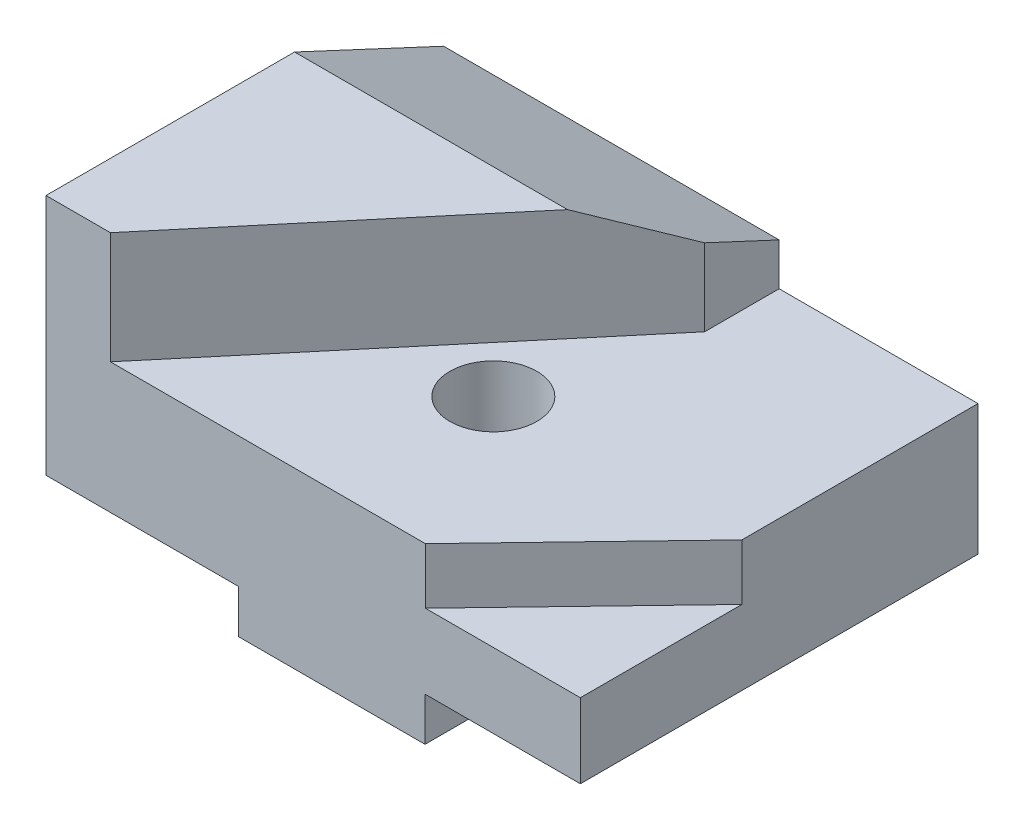
ISO-10303-21;
HEADER;
FILE_DESCRIPTION(('STEP AP214'),'2;1');
FILE_NAME('part.step','',(''),(''),'','','');
FILE_SCHEMA(('AUTOMOTIVE_DESIGN { 1 0 10303 214 1 1 1 1 }'));
ENDSEC;
DATA;
#1=APPLICATION_CONTEXT('core data for automotive mechanical design processes');
#2=APPLICATION_PROTOCOL_DEFINITION('international standard','automotive_design',2000,#1);
#3=PRODUCT_CONTEXT('',#1,'mechanical');
#4=PRODUCT('Part','Part','',(#3));
#5=PRODUCT_RELATED_PRODUCT_CATEGORY('part','',(#4));
#6=PRODUCT_DEFINITION_FORMATION('','',#4);
#7=PRODUCT_DEFINITION_CONTEXT('part definition',#1,'design');
#8=PRODUCT_DEFINITION('design','',#6,#7);
#9=PRODUCT_DEFINITION_SHAPE('','',#8);
#10=(LENGTH_UNIT() NAMED_UNIT(*) SI_UNIT(.MILLI.,.METRE.));
#11=(NAMED_UNIT(*) PLANE_ANGLE_UNIT() SI_UNIT($,.RADIAN.));
#12=(NAMED_UNIT(*) SI_UNIT($,.STERADIAN.) SOLID_ANGLE_UNIT());
#13=UNCERTAINTY_MEASURE_WITH_UNIT(LENGTH_MEASURE(1.E-05),#10,'distance_accuracy_value','');
#14=(GEOMETRIC_REPRESENTATION_CONTEXT(3) GLOBAL_UNCERTAINTY_ASSIGNED_CONTEXT((#13)) GLOBAL_UNIT_ASSIGNED_CONTEXT((#10,
#11,#12)) REPRESENTATION_CONTEXT('',''));
#15=CARTESIAN_POINT('',(0.,0.,0.));
#16=DIRECTION('',(0.,0.,1.));
#17=DIRECTION('',(1.,0.,0.));
#18=AXIS2_PLACEMENT_3D('',#15,#16,#17);
#19=CARTESIAN_POINT('',(86.,21.,-64.));
#20=DIRECTION('',(1.,0.,0.));
#21=DIRECTION('',(0.,0.,-1.));
#22=AXIS2_PLACEMENT_3D('',#19,#20,#21);
#23=PLANE('',#22);
#24=DIRECTION('',(0.,1.,0.));
#25=VECTOR('',#24,1.);
#26=CARTESIAN_POINT('',(86.,12.,-26.));
#27=LINE('',#26,#25);
#28=CARTESIAN_POINT('',(86.,12.,-26.));
#29=VERTEX_POINT('',#28);
#30=CARTESIAN_POINT('',(86.,21.,-26.));
#31=VERTEX_POINT('',#30);
#32=EDGE_CURVE('E149',#29,#31,#27,.T.);
#33=ORIENTED_EDGE('',*,*,#32,.F.);
#34=DIRECTION('',(0.,0.,1.));
#35=VECTOR('',#34,1.);
#36=CARTESIAN_POINT('',(86.,12.,0.));
#37=LINE('',#36,#35);
#38=CARTESIAN_POINT('',(86.,12.,0.));
#39=VERTEX_POINT('',#38);
#40=EDGE_CURVE('E140',#29,#39,#37,.T.);
#41=ORIENTED_EDGE('',*,*,#40,.T.);
#42=DIRECTION('',(0.,1.,0.));
#43=VECTOR('',#42,1.);
#44=CARTESIAN_POINT('',(86.,21.,0.));
#45=LINE('',#44,#43);
#46=CARTESIAN_POINT('',(86.,0.,0.));
#47=VERTEX_POINT('',#46);
#48=EDGE_CURVE('E227',#47,#39,#45,.T.);
#49=ORIENTED_EDGE('',*,*,#48,.F.);
#50=DIRECTION('',(0.,0.,1.));
#51=VECTOR('',#50,1.);
#52=CARTESIAN_POINT('',(86.,0.,-64.));
#53=LINE('',#52,#51);
#54=CARTESIAN_POINT('',(86.,0.,-64.));
#55=VERTEX_POINT('',#54);
#56=EDGE_CURVE('E244',#55,#47,#53,.T.);
#57=ORIENTED_EDGE('',*,*,#56,.F.);
#58=DIRECTION('',(0.,1.,0.));
#59=VECTOR('',#58,1.);
#60=CARTESIAN_POINT('',(86.,21.,-64.));
#61=LINE('',#60,#59);
#62=CARTESIAN_POINT('',(86.,21.,-64.));
#63=VERTEX_POINT('',#62);
#64=EDGE_CURVE('E203',#55,#63,#61,.T.);
#65=ORIENTED_EDGE('',*,*,#64,.T.);
#66=DIRECTION('',(0.,0.,1.));
#67=VECTOR('',#66,1.);
#68=CARTESIAN_POINT('',(86.,21.,-64.));
#69=LINE('',#68,#67);
#70=EDGE_CURVE('E152',#63,#31,#69,.T.);
#71=ORIENTED_EDGE('',*,*,#70,.T.);
#72=EDGE_LOOP('',(#33,#41,#49,#57,#65,#71));
#73=FACE_BOUND('',#72,.T.);
#74=ADVANCED_FACE('F39',(#73),#23,.T.);
#75=CARTESIAN_POINT('',(54.,39.,-64.));
#76=DIRECTION('',(1.,0.,0.));
#77=DIRECTION('',(0.,0.,-1.));
#78=AXIS2_PLACEMENT_3D('',#75,#76,#77);
#79=PLANE('',#78);
#80=DIRECTION('',(0.,1.,0.));
#81=VECTOR('',#80,1.);
#82=CARTESIAN_POINT('',(54.,21.,-52.));
#83=LINE('',#82,#81);
#84=CARTESIAN_POINT('',(54.,21.,-52.));
#85=VERTEX_POINT('',#84);
#86=CARTESIAN_POINT('',(54.,33.4043081021401,-52.));
#87=VERTEX_POINT('',#86);
#88=EDGE_CURVE('E65',#85,#87,#83,.T.);
#89=ORIENTED_EDGE('',*,*,#88,.F.);
#90=DIRECTION('',(0.,0.,1.));
#91=VECTOR('',#90,1.);
#92=CARTESIAN_POINT('',(54.,21.,-64.));
#93=LINE('',#92,#91);
#94=CARTESIAN_POINT('',(54.,21.,-64.));
#95=VERTEX_POINT('',#94);
#96=EDGE_CURVE('E238',#95,#85,#93,.T.);
#97=ORIENTED_EDGE('',*,*,#96,.F.);
#98=DIRECTION('',(0.,1.,0.));
#99=VECTOR('',#98,1.);
#100=CARTESIAN_POINT('',(54.,39.,-64.));
#101=LINE('',#100,#99);
#102=CARTESIAN_POINT('',(54.,27.8086162042802,-64.));
#103=VERTEX_POINT('',#102);
#104=EDGE_CURVE('E206',#95,#103,#101,.T.);
#105=ORIENTED_EDGE('',*,*,#104,.T.);
#106=DIRECTION('',(0.,0.422618261740694,0.906307787036653));
#107=VECTOR('',#106,1.);
#108=CARTESIAN_POINT('',(54.,47.3552472512671,-22.0821144470889));
#109=LINE('',#108,#107);
#110=EDGE_CURVE('E175',#103,#87,#109,.T.);
#111=ORIENTED_EDGE('',*,*,#110,.T.);
#112=EDGE_LOOP('',(#89,#97,#105,#111));
#113=FACE_BOUND('',#112,.T.);
#114=ADVANCED_FACE('F287',(#113),#79,.T.);
#115=CARTESIAN_POINT('',(0.,0.,-64.));
#116=DIRECTION('',(0.,0.,-1.));
#117=DIRECTION('',(-1.,0.,0.));
#118=AXIS2_PLACEMENT_3D('',#115,#116,#117);
#119=PLANE('',#118);
#120=DIRECTION('',(0.,-1.,0.));
#121=VECTOR('',#120,1.);
#122=CARTESIAN_POINT('',(0.,0.,-64.));
#123=LINE('',#122,#121);
#124=CARTESIAN_POINT('',(0.,27.8086162042802,-64.));
#125=VERTEX_POINT('',#124);
#126=CARTESIAN_POINT('',(0.,0.,-64.));
#127=VERTEX_POINT('',#126);
#128=EDGE_CURVE('E207',#125,#127,#123,.T.);
#129=ORIENTED_EDGE('',*,*,#128,.F.);
#130=DIRECTION('',(1.,0.,0.));
#131=VECTOR('',#130,1.);
#132=CARTESIAN_POINT('',(0.,27.8086162042802,-64.));
#133=LINE('',#132,#131);
#134=EDGE_CURVE('E177',#125,#103,#133,.T.);
#135=ORIENTED_EDGE('',*,*,#134,.T.);
#136=ORIENTED_EDGE('',*,*,#104,.F.);
#137=DIRECTION('',(-1.,0.,0.));
#138=VECTOR('',#137,1.);
#139=CARTESIAN_POINT('',(54.,21.,-64.));
#140=LINE('',#139,#138);
#141=EDGE_CURVE('E201',#63,#95,#140,.T.);
#142=ORIENTED_EDGE('',*,*,#141,.F.);
#143=ORIENTED_EDGE('',*,*,#64,.F.);
#144=DIRECTION('',(1.,0.,0.));
#145=VECTOR('',#144,1.);
#146=CARTESIAN_POINT('',(86.,0.,-64.));
#147=LINE('',#146,#145);
#148=CARTESIAN_POINT('',(61.,0.,-64.));
#149=VERTEX_POINT('',#148);
#150=EDGE_CURVE('E196',#149,#55,#147,.T.);
#151=ORIENTED_EDGE('',*,*,#150,.F.);
#152=DIRECTION('',(0.,1.,0.));
#153=VECTOR('',#152,1.);
#154=CARTESIAN_POINT('',(61.,0.,-64.));
#155=LINE('',#154,#153);
#156=CARTESIAN_POINT('',(61.,-7.,-64.));
#157=VERTEX_POINT('',#156);
#158=EDGE_CURVE('E193',#157,#149,#155,.T.);
#159=ORIENTED_EDGE('',*,*,#158,.F.);
#160=DIRECTION('',(1.,0.,0.));
#161=VECTOR('',#160,1.);
#162=CARTESIAN_POINT('',(61.,-7.,-64.));
#163=LINE('',#162,#161);
#164=CARTESIAN_POINT('',(31.,-7.,-64.));
#165=VERTEX_POINT('',#164);
#166=EDGE_CURVE('E194',#165,#157,#163,.T.);
#167=ORIENTED_EDGE('',*,*,#166,.F.);
#168=DIRECTION('',(0.,-1.,0.));
#169=VECTOR('',#168,1.);
#170=CARTESIAN_POINT('',(31.,-7.,-64.));
#171=LINE('',#170,#169);
#172=CARTESIAN_POINT('',(31.,0.,-64.));
#173=VERTEX_POINT('',#172);
#174=EDGE_CURVE('E188',#173,#165,#171,.T.);
#175=ORIENTED_EDGE('',*,*,#174,.F.);
#176=DIRECTION('',(1.,0.,0.));
#177=VECTOR('',#176,1.);
#178=CARTESIAN_POINT('',(31.,0.,-64.));
#179=LINE('',#178,#177);
#180=EDGE_CURVE('E183',#127,#173,#179,.T.);
#181=ORIENTED_EDGE('',*,*,#180,.F.);
#182=EDGE_LOOP('',(#129,#135,#136,#142,#143,#151,#159,#167,#175,#181));
#183=FACE_BOUND('',#182,.T.);
#184=ADVANCED_FACE('F271',(#183),#119,.T.);
#185=CARTESIAN_POINT('',(31.,0.,-64.));
#186=DIRECTION('',(0.,-1.,0.));
#187=DIRECTION('',(1.,0.,0.));
#188=AXIS2_PLACEMENT_3D('',#185,#186,#187);
#189=PLANE('',#188);
#190=DIRECTION('',(1.,0.,0.));
#191=VECTOR('',#190,1.);
#192=CARTESIAN_POINT('',(31.,0.,0.));
#193=LINE('',#192,#191);
#194=CARTESIAN_POINT('',(0.,0.,0.));
#195=VERTEX_POINT('',#194);
#196=CARTESIAN_POINT('',(31.,0.,0.));
#197=VERTEX_POINT('',#196);
#198=EDGE_CURVE('E185',#195,#197,#193,.T.);
#199=ORIENTED_EDGE('',*,*,#198,.F.);
#200=DIRECTION('',(0.,0.,1.));
#201=VECTOR('',#200,1.);
#202=CARTESIAN_POINT('',(0.,0.,-64.));
#203=LINE('',#202,#201);
#204=EDGE_CURVE('E231',#127,#195,#203,.T.);
#205=ORIENTED_EDGE('',*,*,#204,.F.);
#206=ORIENTED_EDGE('',*,*,#180,.T.);
#207=DIRECTION('',(0.,0.,1.));
#208=VECTOR('',#207,1.);
#209=CARTESIAN_POINT('',(31.,0.,-64.));
#210=LINE('',#209,#208);
#211=EDGE_CURVE('E211',#173,#197,#210,.T.);
#212=ORIENTED_EDGE('',*,*,#211,.T.);
#213=EDGE_LOOP('',(#199,#205,#206,#212));
#214=FACE_BOUND('',#213,.T.);
#215=ADVANCED_FACE('F41',(#214),#189,.T.);
#216=CARTESIAN_POINT('',(0.,0.,-64.));
#217=DIRECTION('',(-1.,0.,0.));
#218=DIRECTION('',(0.,0.,1.));
#219=AXIS2_PLACEMENT_3D('',#216,#217,#218);
#220=PLANE('',#219);
#221=DIRECTION('',(0.,0.422618261740694,0.906307787036653));
#222=VECTOR('',#221,1.);
#223=CARTESIAN_POINT('',(0.,47.3552472512671,-22.0821144470889));
#224=LINE('',#223,#222);
#225=CARTESIAN_POINT('',(0.,39.,-40.));
#226=VERTEX_POINT('',#225);
#227=EDGE_CURVE('E174',#125,#226,#224,.T.);
#228=ORIENTED_EDGE('',*,*,#227,.F.);
#229=ORIENTED_EDGE('',*,*,#128,.T.);
#230=ORIENTED_EDGE('',*,*,#204,.T.);
#231=DIRECTION('',(0.,-1.,0.));
#232=VECTOR('',#231,1.);
#233=CARTESIAN_POINT('',(0.,0.,0.));
#234=LINE('',#233,#232);
#235=CARTESIAN_POINT('',(0.,39.,0.));
#236=VERTEX_POINT('',#235);
#237=EDGE_CURVE('E189',#236,#195,#234,.T.);
#238=ORIENTED_EDGE('',*,*,#237,.F.);
#239=DIRECTION('',(0.,0.,1.));
#240=VECTOR('',#239,1.);
#241=CARTESIAN_POINT('',(0.,39.,-64.));
#242=LINE('',#241,#240);
#243=EDGE_CURVE('E240',#226,#236,#242,.T.);
#244=ORIENTED_EDGE('',*,*,#243,.F.);
#245=EDGE_LOOP('',(#228,#229,#230,#238,#244));
#246=FACE_BOUND('',#245,.T.);
#247=ADVANCED_FACE('F266',(#246),#220,.T.);
#248=CARTESIAN_POINT('',(0.,39.,-64.));
#249=DIRECTION('',(0.,1.,0.));
#250=DIRECTION('',(0.,0.,1.));
#251=AXIS2_PLACEMENT_3D('',#248,#249,#250);
#252=PLANE('',#251);
#253=DIRECTION('',(-0.642787609686535,0.,0.766044443118982));
#254=VECTOR('',#253,1.);
#255=CARTESIAN_POINT('',(6.08349921869007,39.,5.10466195067005));
#256=LINE('',#255,#254);
#257=CARTESIAN_POINT('',(43.9308044258728,39.,-40.));
#258=VERTEX_POINT('',#257);
#259=CARTESIAN_POINT('',(10.3668191787819,39.,0.));
#260=VERTEX_POINT('',#259);
#261=EDGE_CURVE('E163',#258,#260,#256,.T.);
#262=ORIENTED_EDGE('',*,*,#261,.F.);
#263=DIRECTION('',(1.,0.,0.));
#264=VECTOR('',#263,1.);
#265=CARTESIAN_POINT('',(0.,39.,-40.));
#266=LINE('',#265,#264);
#267=EDGE_CURVE('E176',#226,#258,#266,.T.);
#268=ORIENTED_EDGE('',*,*,#267,.F.);
#269=ORIENTED_EDGE('',*,*,#243,.T.);
#270=DIRECTION('',(-1.,0.,0.));
#271=VECTOR('',#270,1.);
#272=CARTESIAN_POINT('',(0.,39.,0.));
#273=LINE('',#272,#271);
#274=EDGE_CURVE('E226',#260,#236,#273,.T.);
#275=ORIENTED_EDGE('',*,*,#274,.F.);
#276=EDGE_LOOP('',(#262,#268,#269,#275));
#277=FACE_BOUND('',#276,.T.);
#278=ADVANCED_FACE('F257',(#277),#252,.T.);
#279=CARTESIAN_POINT('',(54.,21.,-64.));
#280=DIRECTION('',(0.,1.,0.));
#281=DIRECTION('',(0.,0.,1.));
#282=AXIS2_PLACEMENT_3D('',#279,#280,#281);
#283=PLANE('',#282);
#284=DIRECTION('',(-0.692307692307692,0.,0.72160242458822));
#285=VECTOR('',#284,1.);
#286=CARTESIAN_POINT('',(31.7922214461694,21.,30.5015597408679));
#287=LINE('',#286,#285);
#288=CARTESIAN_POINT('',(61.0555161863936,21.,0.));
#289=VERTEX_POINT('',#288);
#290=EDGE_CURVE('E144',#31,#289,#287,.T.);
#291=ORIENTED_EDGE('',*,*,#290,.F.);
#292=ORIENTED_EDGE('',*,*,#70,.F.);
#293=ORIENTED_EDGE('',*,*,#141,.T.);
#294=ORIENTED_EDGE('',*,*,#96,.T.);
#295=DIRECTION('',(-0.642787609686535,0.,0.766044443118982));
#296=VECTOR('',#295,1.);
#297=CARTESIAN_POINT('',(6.08349921869007,21.,5.10466195067005));
#298=LINE('',#297,#296);
#299=CARTESIAN_POINT('',(10.3668191787819,21.,0.));
#300=VERTEX_POINT('',#299);
#301=EDGE_CURVE('E164',#85,#300,#298,.T.);
#302=ORIENTED_EDGE('',*,*,#301,.T.);
#303=DIRECTION('',(-1.,0.,0.));
#304=VECTOR('',#303,1.);
#305=CARTESIAN_POINT('',(54.,21.,0.));
#306=LINE('',#305,#304);
#307=EDGE_CURVE('E228',#289,#300,#306,.T.);
#308=ORIENTED_EDGE('',*,*,#307,.F.);
#309=EDGE_LOOP('',(#291,#292,#293,#294,#302,#308));
#310=FACE_BOUND('',#309,.T.);
#311=CARTESIAN_POINT('',(46.,21.,-26.));
#312=DIRECTION('',(0.,1.,0.));
#313=DIRECTION('',(0.,0.,1.));
#314=AXIS2_PLACEMENT_3D('',#311,#312,#313);
#315=CIRCLE('',#314,7.);
#316=CARTESIAN_POINT('',(46.,21.,-19.));
#317=VERTEX_POINT('',#316);
#318=EDGE_CURVE('E158',#317,#317,#315,.F.);
#319=ORIENTED_EDGE('',*,*,#318,.T.);
#320=EDGE_LOOP('',(#319));
#321=FACE_BOUND('',#320,.T.);
#322=ADVANCED_FACE('F285',(#310,#321),#283,.T.);
#323=CARTESIAN_POINT('',(86.,0.,-64.));
#324=DIRECTION('',(0.,-1.,0.));
#325=DIRECTION('',(1.,0.,0.));
#326=AXIS2_PLACEMENT_3D('',#323,#324,#325);
#327=PLANE('',#326);
#328=DIRECTION('',(1.,0.,0.));
#329=VECTOR('',#328,1.);
#330=CARTESIAN_POINT('',(86.,0.,0.));
#331=LINE('',#330,#329);
#332=CARTESIAN_POINT('',(61.,0.,0.));
#333=VERTEX_POINT('',#332);
#334=EDGE_CURVE('E224',#333,#47,#331,.T.);
#335=ORIENTED_EDGE('',*,*,#334,.F.);
#336=DIRECTION('',(0.,0.,1.));
#337=VECTOR('',#336,1.);
#338=CARTESIAN_POINT('',(61.,0.,-64.));
#339=LINE('',#338,#337);
#340=EDGE_CURVE('E247',#149,#333,#339,.T.);
#341=ORIENTED_EDGE('',*,*,#340,.F.);
#342=ORIENTED_EDGE('',*,*,#150,.T.);
#343=ORIENTED_EDGE('',*,*,#56,.T.);
#344=EDGE_LOOP('',(#335,#341,#342,#343));
#345=FACE_BOUND('',#344,.T.);
#346=ADVANCED_FACE('F292',(#345),#327,.T.);
#347=CARTESIAN_POINT('',(61.,0.,-64.));
#348=DIRECTION('',(1.,0.,0.));
#349=DIRECTION('',(0.,0.,-1.));
#350=AXIS2_PLACEMENT_3D('',#347,#348,#349);
#351=PLANE('',#350);
#352=DIRECTION('',(0.,1.,0.));
#353=VECTOR('',#352,1.);
#354=CARTESIAN_POINT('',(61.,0.,0.));
#355=LINE('',#354,#353);
#356=CARTESIAN_POINT('',(61.,-7.,0.));
#357=VERTEX_POINT('',#356);
#358=EDGE_CURVE('E219',#357,#333,#355,.T.);
#359=ORIENTED_EDGE('',*,*,#358,.F.);
#360=DIRECTION('',(0.,0.,1.));
#361=VECTOR('',#360,1.);
#362=CARTESIAN_POINT('',(61.,-7.,-64.));
#363=LINE('',#362,#361);
#364=EDGE_CURVE('E250',#157,#357,#363,.T.);
#365=ORIENTED_EDGE('',*,*,#364,.F.);
#366=ORIENTED_EDGE('',*,*,#158,.T.);
#367=ORIENTED_EDGE('',*,*,#340,.T.);
#368=EDGE_LOOP('',(#359,#365,#366,#367));
#369=FACE_BOUND('',#368,.T.);
#370=ADVANCED_FACE('F293',(#369),#351,.T.);
#371=CARTESIAN_POINT('',(61.,-7.,-64.));
#372=DIRECTION('',(0.,-1.,0.));
#373=DIRECTION('',(1.,0.,0.));
#374=AXIS2_PLACEMENT_3D('',#371,#372,#373);
#375=PLANE('',#374);
#376=CARTESIAN_POINT('',(46.,-7.,-26.));
#377=DIRECTION('',(0.,-1.,0.));
#378=DIRECTION('',(1.,0.,0.));
#379=AXIS2_PLACEMENT_3D('',#376,#377,#378);
#380=CIRCLE('',#379,7.);
#381=CARTESIAN_POINT('',(53.,-7.,-26.));
#382=VERTEX_POINT('',#381);
#383=EDGE_CURVE('E154',#382,#382,#380,.F.);
#384=ORIENTED_EDGE('',*,*,#383,.T.);
#385=EDGE_LOOP('',(#384));
#386=FACE_BOUND('',#385,.T.);
#387=DIRECTION('',(1.,0.,0.));
#388=VECTOR('',#387,1.);
#389=CARTESIAN_POINT('',(61.,-7.,0.));
#390=LINE('',#389,#388);
#391=CARTESIAN_POINT('',(31.,-7.,0.));
#392=VERTEX_POINT('',#391);
#393=EDGE_CURVE('E220',#392,#357,#390,.T.);
#394=ORIENTED_EDGE('',*,*,#393,.F.);
#395=DIRECTION('',(0.,0.,1.));
#396=VECTOR('',#395,1.);
#397=CARTESIAN_POINT('',(31.,-7.,-64.));
#398=LINE('',#397,#396);
#399=EDGE_CURVE('E248',#165,#392,#398,.T.);
#400=ORIENTED_EDGE('',*,*,#399,.F.);
#401=ORIENTED_EDGE('',*,*,#166,.T.);
#402=ORIENTED_EDGE('',*,*,#364,.T.);
#403=EDGE_LOOP('',(#394,#400,#401,#402));
#404=FACE_BOUND('',#403,.T.);
#405=ADVANCED_FACE('F298',(#386,#404),#375,.T.);
#406=CARTESIAN_POINT('',(31.,-7.,-64.));
#407=DIRECTION('',(-1.,0.,0.));
#408=DIRECTION('',(0.,0.,1.));
#409=AXIS2_PLACEMENT_3D('',#406,#407,#408);
#410=PLANE('',#409);
#411=DIRECTION('',(0.,-1.,0.));
#412=VECTOR('',#411,1.);
#413=CARTESIAN_POINT('',(31.,-7.,0.));
#414=LINE('',#413,#412);
#415=EDGE_CURVE('E212',#197,#392,#414,.T.);
#416=ORIENTED_EDGE('',*,*,#415,.F.);
#417=ORIENTED_EDGE('',*,*,#211,.F.);
#418=ORIENTED_EDGE('',*,*,#174,.T.);
#419=ORIENTED_EDGE('',*,*,#399,.T.);
#420=EDGE_LOOP('',(#416,#417,#418,#419));
#421=FACE_BOUND('',#420,.T.);
#422=ADVANCED_FACE('F296',(#421),#410,.T.);
#423=CARTESIAN_POINT('',(0.,0.,0.));
#424=DIRECTION('',(0.,0.,-1.));
#425=DIRECTION('',(-1.,0.,0.));
#426=AXIS2_PLACEMENT_3D('',#423,#424,#425);
#427=PLANE('',#426);
#428=DIRECTION('',(1.,0.,0.));
#429=VECTOR('',#428,1.);
#430=CARTESIAN_POINT('',(0.,12.,0.));
#431=LINE('',#430,#429);
#432=CARTESIAN_POINT('',(61.0555161863936,12.,0.));
#433=VERTEX_POINT('',#432);
#434=EDGE_CURVE('E50',#433,#39,#431,.T.);
#435=ORIENTED_EDGE('',*,*,#434,.F.);
#436=DIRECTION('',(0.,1.,0.));
#437=VECTOR('',#436,1.);
#438=CARTESIAN_POINT('',(61.0555161863936,0.,0.));
#439=LINE('',#438,#437);
#440=EDGE_CURVE('E11',#433,#289,#439,.T.);
#441=ORIENTED_EDGE('',*,*,#440,.T.);
#442=ORIENTED_EDGE('',*,*,#307,.T.);
#443=DIRECTION('',(0.,1.,0.));
#444=VECTOR('',#443,1.);
#445=CARTESIAN_POINT('',(10.3668191787819,21.,0.));
#446=LINE('',#445,#444);
#447=EDGE_CURVE('E166',#300,#260,#446,.T.);
#448=ORIENTED_EDGE('',*,*,#447,.T.);
#449=ORIENTED_EDGE('',*,*,#274,.T.);
#450=ORIENTED_EDGE('',*,*,#237,.T.);
#451=ORIENTED_EDGE('',*,*,#198,.T.);
#452=ORIENTED_EDGE('',*,*,#415,.T.);
#453=ORIENTED_EDGE('',*,*,#393,.T.);
#454=ORIENTED_EDGE('',*,*,#358,.T.);
#455=ORIENTED_EDGE('',*,*,#334,.T.);
#456=ORIENTED_EDGE('',*,*,#48,.T.);
#457=EDGE_LOOP('',(#435,#441,#442,#448,#449,#450,#451,#452,#453,#454,#455,#456));
#458=FACE_BOUND('',#457,.T.);
#459=ADVANCED_FACE('F276',(#458),#427,.F.);
#460=CARTESIAN_POINT('',(0.,47.3552472512671,-22.0821144470889));
#461=DIRECTION('',(0.,0.906307787036653,-0.422618261740694));
#462=DIRECTION('',(0.,0.422618261740694,0.906307787036653));
#463=AXIS2_PLACEMENT_3D('',#460,#461,#462);
#464=PLANE('',#463);
#465=DIRECTION('',(-0.605326699380338,0.336394469880422,0.721400268679722));
#466=VECTOR('',#465,1.);
#467=CARTESIAN_POINT('',(18.3078607941611,53.2392802904433,-9.46376487406839));
#468=LINE('',#467,#466);
#469=EDGE_CURVE('E237',#87,#258,#468,.T.);
#470=ORIENTED_EDGE('',*,*,#469,.F.);
#471=ORIENTED_EDGE('',*,*,#110,.F.);
#472=ORIENTED_EDGE('',*,*,#134,.F.);
#473=ORIENTED_EDGE('',*,*,#227,.T.);
#474=ORIENTED_EDGE('',*,*,#267,.T.);
#475=EDGE_LOOP('',(#470,#471,#472,#473,#474));
#476=FACE_BOUND('',#475,.T.);
#477=ADVANCED_FACE('F265',(#476),#464,.T.);
#478=CARTESIAN_POINT('',(6.08349921869007,21.,5.10466195067005));
#479=DIRECTION('',(-0.766044443118982,0.,-0.642787609686535));
#480=DIRECTION('',(-0.642787609686535,0.,0.766044443118982));
#481=AXIS2_PLACEMENT_3D('',#478,#479,#480);
#482=PLANE('',#481);
#483=ORIENTED_EDGE('',*,*,#469,.T.);
#484=ORIENTED_EDGE('',*,*,#261,.T.);
#485=ORIENTED_EDGE('',*,*,#447,.F.);
#486=ORIENTED_EDGE('',*,*,#301,.F.);
#487=ORIENTED_EDGE('',*,*,#88,.T.);
#488=EDGE_LOOP('',(#483,#484,#485,#486,#487));
#489=FACE_BOUND('',#488,.T.);
#490=ADVANCED_FACE('F255',(#489),#482,.F.);
#491=CARTESIAN_POINT('',(46.,-7.001,-26.));
#492=DIRECTION('',(0.,1.,0.));
#493=DIRECTION('',(0.,0.,1.));
#494=AXIS2_PLACEMENT_3D('',#491,#492,#493);
#495=CYLINDRICAL_SURFACE('',#494,7.);
#496=ORIENTED_EDGE('',*,*,#318,.F.);
#497=EDGE_LOOP('',(#496));
#498=FACE_BOUND('',#497,.T.);
#499=ORIENTED_EDGE('',*,*,#383,.F.);
#500=EDGE_LOOP('',(#499));
#501=FACE_BOUND('',#500,.T.);
#502=ADVANCED_FACE('F410',(#498,#501),#495,.F.);
#503=CARTESIAN_POINT('',(31.7922214461694,12.,30.5015597408679));
#504=DIRECTION('',(-0.72160242458822,0.,-0.692307692307692));
#505=DIRECTION('',(-0.692307692307692,0.,0.72160242458822));
#506=AXIS2_PLACEMENT_3D('',#503,#504,#505);
#507=PLANE('',#506);
#508=DIRECTION('',(-0.692307692307692,0.,0.72160242458822));
#509=VECTOR('',#508,1.);
#510=CARTESIAN_POINT('',(31.7922214461694,12.,30.5015597408679));
#511=LINE('',#510,#509);
#512=EDGE_CURVE('E53',#29,#433,#511,.T.);
#513=ORIENTED_EDGE('',*,*,#512,.F.);
#514=ORIENTED_EDGE('',*,*,#32,.T.);
#515=ORIENTED_EDGE('',*,*,#290,.T.);
#516=ORIENTED_EDGE('',*,*,#440,.F.);
#517=EDGE_LOOP('',(#513,#514,#515,#516));
#518=FACE_BOUND('',#517,.T.);
#519=ADVANCED_FACE('F146',(#518),#507,.F.);
#520=CARTESIAN_POINT('',(0.,12.,0.));
#521=DIRECTION('',(0.,1.,0.));
#522=DIRECTION('',(0.,0.,1.));
#523=AXIS2_PLACEMENT_3D('',#520,#521,#522);
#524=PLANE('',#523);
#525=ORIENTED_EDGE('',*,*,#434,.T.);
#526=ORIENTED_EDGE('',*,*,#40,.F.);
#527=ORIENTED_EDGE('',*,*,#512,.T.);
#528=EDGE_LOOP('',(#525,#526,#527));
#529=FACE_BOUND('',#528,.T.);
#530=ADVANCED_FACE('F136',(#529),#524,.T.);
#531=CLOSED_SHELL('',(#74,#114,#184,#215,#247,#278,#322,#346,#370,#405,#422,#459,#477,#490,#502,
#519,#530));
#532=MANIFOLD_SOLID_BREP('B2',#531);
#533=ADVANCED_BREP_SHAPE_REPRESENTATION('',(#18,#532),#14);
#534=SHAPE_DEFINITION_REPRESENTATION(#9,#533);
ENDSEC;
END-ISO-10303-21;
